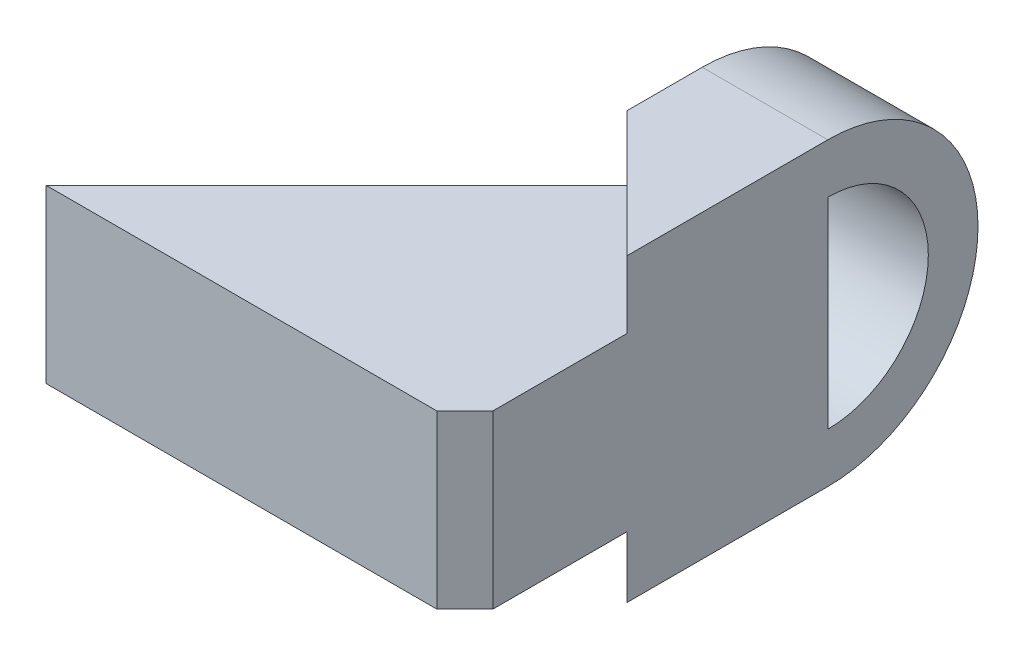
ISO-10303-21;
HEADER;
FILE_DESCRIPTION(('STEP AP214'),'2;1');
FILE_NAME('part.step','',(''),(''),'','','');
FILE_SCHEMA(('AUTOMOTIVE_DESIGN { 1 0 10303 214 1 1 1 1 }'));
ENDSEC;
DATA;
#1=APPLICATION_CONTEXT('core data for automotive mechanical design processes');
#2=APPLICATION_PROTOCOL_DEFINITION('international standard','automotive_design',2000,#1);
#3=PRODUCT_CONTEXT('',#1,'mechanical');
#4=PRODUCT('Part','Part','',(#3));
#5=PRODUCT_RELATED_PRODUCT_CATEGORY('part','',(#4));
#6=PRODUCT_DEFINITION_FORMATION('','',#4);
#7=PRODUCT_DEFINITION_CONTEXT('part definition',#1,'design');
#8=PRODUCT_DEFINITION('design','',#6,#7);
#9=PRODUCT_DEFINITION_SHAPE('','',#8);
#10=(LENGTH_UNIT() NAMED_UNIT(*) SI_UNIT(.MILLI.,.METRE.));
#11=(NAMED_UNIT(*) PLANE_ANGLE_UNIT() SI_UNIT($,.RADIAN.));
#12=(NAMED_UNIT(*) SI_UNIT($,.STERADIAN.) SOLID_ANGLE_UNIT());
#13=UNCERTAINTY_MEASURE_WITH_UNIT(LENGTH_MEASURE(1.E-05),#10,'distance_accuracy_value','');
#14=(GEOMETRIC_REPRESENTATION_CONTEXT(3) GLOBAL_UNCERTAINTY_ASSIGNED_CONTEXT((#13)) GLOBAL_UNIT_ASSIGNED_CONTEXT((#10,
#11,#12)) REPRESENTATION_CONTEXT('',''));
#15=CARTESIAN_POINT('',(0.,0.,0.));
#16=DIRECTION('',(0.,0.,1.));
#17=DIRECTION('',(1.,0.,0.));
#18=AXIS2_PLACEMENT_3D('',#15,#16,#17);
#19=CARTESIAN_POINT('',(15.0000000000003,0.,21.));
#20=DIRECTION('',(-0.707106781186544,0.,0.707106781186551));
#21=DIRECTION('',(0.,1.,0.));
#22=AXIS2_PLACEMENT_3D('',#19,#20,#21);
#23=PLANE('',#22);
#24=DIRECTION('',(-0.707106781186551,0.,-0.707106781186544));
#25=VECTOR('',#24,1.);
#26=CARTESIAN_POINT('',(1.81789792113166,6.59564539546917,7.81789792113153));
#27=LINE('',#26,#25);
#28=CARTESIAN_POINT('',(9.99999999999999,6.59564539546917,15.9999999999998));
#29=VERTEX_POINT('',#28);
#30=CARTESIAN_POINT('',(0.,6.59564539546917,5.99999999999989));
#31=VERTEX_POINT('',#30);
#32=EDGE_CURVE('E208',#29,#31,#27,.T.);
#33=ORIENTED_EDGE('',*,*,#32,.F.);
#34=DIRECTION('',(0.,-1.,0.));
#35=VECTOR('',#34,1.);
#36=CARTESIAN_POINT('',(9.99999999999999,0.,15.9999999999998));
#37=LINE('',#36,#35);
#38=CARTESIAN_POINT('',(9.99999999999999,11.9554978606266,15.9999999999998));
#39=VERTEX_POINT('',#38);
#40=EDGE_CURVE('E249',#39,#29,#37,.T.);
#41=ORIENTED_EDGE('',*,*,#40,.F.);
#42=DIRECTION('',(0.707106781186551,0.,0.707106781186544));
#43=VECTOR('',#42,1.);
#44=CARTESIAN_POINT('',(15.0000000000003,11.9554978606266,21.));
#45=LINE('',#44,#43);
#46=CARTESIAN_POINT('',(0.,11.9554978606266,5.99999999999989));
#47=VERTEX_POINT('',#46);
#48=EDGE_CURVE('E258',#47,#39,#45,.T.);
#49=ORIENTED_EDGE('',*,*,#48,.F.);
#50=DIRECTION('',(0.,1.,0.));
#51=VECTOR('',#50,1.);
#52=CARTESIAN_POINT('',(0.,11.9554978606266,5.99999999999989));
#53=LINE('',#52,#51);
#54=EDGE_CURVE('E254',#31,#47,#53,.T.);
#55=ORIENTED_EDGE('',*,*,#54,.F.);
#56=EDGE_LOOP('',(#33,#41,#49,#55));
#57=FACE_BOUND('',#56,.T.);
#58=ADVANCED_FACE('F46',(#57),#23,.T.);
#59=CARTESIAN_POINT('',(9.99999999999999,0.,0.));
#60=DIRECTION('',(-1.,0.,0.));
#61=DIRECTION('',(0.,0.,1.));
#62=AXIS2_PLACEMENT_3D('',#59,#60,#61);
#63=CYLINDRICAL_SURFACE('',#62,11.9554978606266);
#64=DIRECTION('',(-1.,0.,0.));
#65=VECTOR('',#64,1.);
#66=CARTESIAN_POINT('',(0.,11.9554978606266,0.));
#67=LINE('',#66,#65);
#68=CARTESIAN_POINT('',(9.99999999999999,11.9554978606266,0.));
#69=VERTEX_POINT('',#68);
#70=CARTESIAN_POINT('',(0.,11.9554978606266,0.));
#71=VERTEX_POINT('',#70);
#72=EDGE_CURVE('E219',#69,#71,#67,.T.);
#73=ORIENTED_EDGE('',*,*,#72,.F.);
#74=CARTESIAN_POINT('',(9.99999999999999,0.,0.));
#75=DIRECTION('',(1.,0.,0.));
#76=DIRECTION('',(0.,0.,-1.));
#77=AXIS2_PLACEMENT_3D('',#74,#75,#76);
#78=CIRCLE('',#77,11.9554978606266);
#79=CARTESIAN_POINT('',(9.99999999999999,-11.9554978606266,0.));
#80=VERTEX_POINT('',#79);
#81=EDGE_CURVE('E237',#80,#69,#78,.T.);
#82=ORIENTED_EDGE('',*,*,#81,.F.);
#83=DIRECTION('',(1.,0.,0.));
#84=VECTOR('',#83,1.);
#85=CARTESIAN_POINT('',(0.,-11.9554978606266,0.));
#86=LINE('',#85,#84);
#87=CARTESIAN_POINT('',(0.,-11.9554978606266,0.));
#88=VERTEX_POINT('',#87);
#89=EDGE_CURVE('E213',#88,#80,#86,.T.);
#90=ORIENTED_EDGE('',*,*,#89,.F.);
#91=CARTESIAN_POINT('',(0.,0.,0.));
#92=DIRECTION('',(1.,0.,0.));
#93=DIRECTION('',(0.,0.,-1.));
#94=AXIS2_PLACEMENT_3D('',#91,#92,#93);
#95=CIRCLE('',#94,11.9554978606266);
#96=EDGE_CURVE('E234',#88,#71,#95,.T.);
#97=ORIENTED_EDGE('',*,*,#96,.T.);
#98=EDGE_LOOP('',(#73,#82,#90,#97));
#99=FACE_BOUND('',#98,.T.);
#100=ADVANCED_FACE('F318',(#99),#63,.T.);
#101=CARTESIAN_POINT('',(9.99999999999999,0.,0.));
#102=DIRECTION('',(-1.,0.,0.));
#103=DIRECTION('',(0.,0.,1.));
#104=AXIS2_PLACEMENT_3D('',#101,#102,#103);
#105=CYLINDRICAL_SURFACE('',#104,8.);
#106=CARTESIAN_POINT('',(9.99999999999999,0.,0.));
#107=DIRECTION('',(1.,0.,0.));
#108=DIRECTION('',(0.,0.,-1.));
#109=AXIS2_PLACEMENT_3D('',#106,#107,#108);
#110=CIRCLE('',#109,8.);
#111=CARTESIAN_POINT('',(9.99999999999999,-8.,0.));
#112=VERTEX_POINT('',#111);
#113=CARTESIAN_POINT('',(9.99999999999999,8.,0.));
#114=VERTEX_POINT('',#113);
#115=EDGE_CURVE('E231',#112,#114,#110,.T.);
#116=ORIENTED_EDGE('',*,*,#115,.T.);
#117=DIRECTION('',(-1.,0.,0.));
#118=VECTOR('',#117,1.);
#119=CARTESIAN_POINT('',(9.99999999999999,8.,0.));
#120=LINE('',#119,#118);
#121=CARTESIAN_POINT('',(0.,8.,0.));
#122=VERTEX_POINT('',#121);
#123=EDGE_CURVE('E245',#114,#122,#120,.T.);
#124=ORIENTED_EDGE('',*,*,#123,.T.);
#125=CARTESIAN_POINT('',(0.,0.,0.));
#126=DIRECTION('',(1.,0.,0.));
#127=DIRECTION('',(0.,0.,-1.));
#128=AXIS2_PLACEMENT_3D('',#125,#126,#127);
#129=CIRCLE('',#128,8.);
#130=CARTESIAN_POINT('',(0.,-8.,0.));
#131=VERTEX_POINT('',#130);
#132=EDGE_CURVE('E230',#131,#122,#129,.T.);
#133=ORIENTED_EDGE('',*,*,#132,.F.);
#134=DIRECTION('',(-1.,0.,0.));
#135=VECTOR('',#134,1.);
#136=CARTESIAN_POINT('',(9.99999999999999,-8.,0.));
#137=LINE('',#136,#135);
#138=EDGE_CURVE('E240',#131,#112,#137,.F.);
#139=ORIENTED_EDGE('',*,*,#138,.T.);
#140=EDGE_LOOP('',(#116,#124,#133,#139));
#141=FACE_BOUND('',#140,.T.);
#142=ADVANCED_FACE('F286',(#141),#105,.F.);
#143=CARTESIAN_POINT('',(9.99999999999999,0.,0.));
#144=DIRECTION('',(1.,0.,0.));
#145=DIRECTION('',(0.,0.,-1.));
#146=AXIS2_PLACEMENT_3D('',#143,#144,#145);
#147=PLANE('',#146);
#148=ORIENTED_EDGE('',*,*,#40,.T.);
#149=DIRECTION('',(0.,0.,1.));
#150=VECTOR('',#149,1.);
#151=CARTESIAN_POINT('',(9.99999999999999,6.59564539546917,4.10429891407645));
#152=LINE('',#151,#150);
#153=CARTESIAN_POINT('',(10.,6.59564539546917,26.6654108615308));
#154=VERTEX_POINT('',#153);
#155=EDGE_CURVE('E157',#29,#154,#152,.T.);
#156=ORIENTED_EDGE('',*,*,#155,.T.);
#157=DIRECTION('',(0.,-1.,0.));
#158=VECTOR('',#157,1.);
#159=CARTESIAN_POINT('',(9.99999999999999,0.,26.6654108615308));
#160=LINE('',#159,#158);
#161=CARTESIAN_POINT('',(9.99999999999999,-7.07359071398134,26.6654108615308));
#162=VERTEX_POINT('',#161);
#163=EDGE_CURVE('E170',#154,#162,#160,.T.);
#164=ORIENTED_EDGE('',*,*,#163,.T.);
#165=DIRECTION('',(0.,0.,1.));
#166=VECTOR('',#165,1.);
#167=CARTESIAN_POINT('',(10.,-7.07359071398134,31.1524217002877));
#168=LINE('',#167,#166);
#169=CARTESIAN_POINT('',(10.,-7.07359071398134,15.9999999999998));
#170=VERTEX_POINT('',#169);
#171=EDGE_CURVE('E176',#170,#162,#168,.T.);
#172=ORIENTED_EDGE('',*,*,#171,.F.);
#173=CARTESIAN_POINT('',(9.99999999999999,-11.9554978606266,15.9999999999998));
#174=VERTEX_POINT('',#173);
#175=EDGE_CURVE('E248',#170,#174,#37,.T.);
#176=ORIENTED_EDGE('',*,*,#175,.T.);
#177=DIRECTION('',(0.,0.,-1.));
#178=VECTOR('',#177,1.);
#179=CARTESIAN_POINT('',(9.99999999999999,-11.9554978606266,21.));
#180=LINE('',#179,#178);
#181=EDGE_CURVE('E226',#174,#80,#180,.T.);
#182=ORIENTED_EDGE('',*,*,#181,.T.);
#183=ORIENTED_EDGE('',*,*,#81,.T.);
#184=DIRECTION('',(0.,0.,-1.));
#185=VECTOR('',#184,1.);
#186=CARTESIAN_POINT('',(9.99999999999999,11.9554978606266,21.));
#187=LINE('',#186,#185);
#188=EDGE_CURVE('E224',#39,#69,#187,.T.);
#189=ORIENTED_EDGE('',*,*,#188,.F.);
#190=EDGE_LOOP('',(#148,#156,#164,#172,#176,#182,#183,#189));
#191=FACE_BOUND('',#190,.T.);
#192=DIRECTION('',(0.,1.,0.));
#193=VECTOR('',#192,1.);
#194=CARTESIAN_POINT('',(9.99999999999999,11.9554978606266,0.));
#195=LINE('',#194,#193);
#196=EDGE_CURVE('E216',#112,#114,#195,.T.);
#197=ORIENTED_EDGE('',*,*,#196,.T.);
#198=ORIENTED_EDGE('',*,*,#115,.F.);
#199=EDGE_LOOP('',(#197,#198));
#200=FACE_BOUND('',#199,.T.);
#201=ADVANCED_FACE('F285',(#191,#200),#147,.T.);
#202=CARTESIAN_POINT('',(0.,0.,0.));
#203=DIRECTION('',(1.,0.,0.));
#204=DIRECTION('',(0.,0.,-1.));
#205=AXIS2_PLACEMENT_3D('',#202,#203,#204);
#206=PLANE('',#205);
#207=ORIENTED_EDGE('',*,*,#132,.T.);
#208=DIRECTION('',(0.,-1.,0.));
#209=VECTOR('',#208,1.);
#210=CARTESIAN_POINT('',(0.,11.9554978606266,0.));
#211=LINE('',#210,#209);
#212=EDGE_CURVE('E210',#122,#131,#211,.T.);
#213=ORIENTED_EDGE('',*,*,#212,.T.);
#214=EDGE_LOOP('',(#207,#213));
#215=FACE_BOUND('',#214,.T.);
#216=DIRECTION('',(0.,-1.,0.));
#217=VECTOR('',#216,1.);
#218=CARTESIAN_POINT('',(0.,0.,5.55271248932269));
#219=LINE('',#218,#217);
#220=CARTESIAN_POINT('',(0.,6.59564539546917,5.55271248932268));
#221=VERTEX_POINT('',#220);
#222=CARTESIAN_POINT('',(0.,-7.07359071398134,5.55271248932268));
#223=VERTEX_POINT('',#222);
#224=EDGE_CURVE('E202',#221,#223,#219,.T.);
#225=ORIENTED_EDGE('',*,*,#224,.F.);
#226=DIRECTION('',(0.,0.,1.));
#227=VECTOR('',#226,1.);
#228=CARTESIAN_POINT('',(0.,6.59564539546917,0.));
#229=LINE('',#228,#227);
#230=EDGE_CURVE('E197',#221,#31,#229,.T.);
#231=ORIENTED_EDGE('',*,*,#230,.T.);
#232=ORIENTED_EDGE('',*,*,#54,.T.);
#233=DIRECTION('',(0.,0.,-1.));
#234=VECTOR('',#233,1.);
#235=CARTESIAN_POINT('',(0.,11.9554978606266,21.));
#236=LINE('',#235,#234);
#237=EDGE_CURVE('E222',#47,#71,#236,.T.);
#238=ORIENTED_EDGE('',*,*,#237,.T.);
#239=ORIENTED_EDGE('',*,*,#96,.F.);
#240=DIRECTION('',(0.,0.,-1.));
#241=VECTOR('',#240,1.);
#242=CARTESIAN_POINT('',(0.,-11.9554978606266,21.));
#243=LINE('',#242,#241);
#244=CARTESIAN_POINT('',(0.,-11.9554978606266,5.99999999999989));
#245=VERTEX_POINT('',#244);
#246=EDGE_CURVE('E228',#245,#88,#243,.T.);
#247=ORIENTED_EDGE('',*,*,#246,.F.);
#248=CARTESIAN_POINT('',(0.,-7.07359071398134,5.99999999999989));
#249=VERTEX_POINT('',#248);
#250=EDGE_CURVE('E255',#245,#249,#53,.T.);
#251=ORIENTED_EDGE('',*,*,#250,.T.);
#252=DIRECTION('',(0.,0.,-1.));
#253=VECTOR('',#252,1.);
#254=CARTESIAN_POINT('',(0.,-7.07359071398134,0.));
#255=LINE('',#254,#253);
#256=EDGE_CURVE('E190',#249,#223,#255,.T.);
#257=ORIENTED_EDGE('',*,*,#256,.T.);
#258=EDGE_LOOP('',(#225,#231,#232,#238,#239,#247,#251,#257));
#259=FACE_BOUND('',#258,.T.);
#260=ADVANCED_FACE('F279',(#215,#259),#206,.F.);
#261=CARTESIAN_POINT('',(0.,0.,0.));
#262=DIRECTION('',(0.,0.,1.));
#263=DIRECTION('',(1.,0.,0.));
#264=AXIS2_PLACEMENT_3D('',#261,#262,#263);
#265=PLANE('',#264);
#266=DIRECTION('',(0.,1.,0.));
#267=VECTOR('',#266,1.);
#268=CARTESIAN_POINT('',(5.8957010859235,0.,0.));
#269=LINE('',#268,#267);
#270=CARTESIAN_POINT('',(5.8957010859235,-7.07359071398134,0.));
#271=VERTEX_POINT('',#270);
#272=CARTESIAN_POINT('',(5.8957010859235,6.59564539546917,0.));
#273=VERTEX_POINT('',#272);
#274=EDGE_CURVE('E55',#271,#273,#269,.T.);
#275=ORIENTED_EDGE('',*,*,#274,.T.);
#276=DIRECTION('',(-1.,0.,0.));
#277=VECTOR('',#276,1.);
#278=CARTESIAN_POINT('',(0.,6.59564539546917,0.));
#279=LINE('',#278,#277);
#280=CARTESIAN_POINT('',(5.55271248932263,6.59564539546917,0.));
#281=VERTEX_POINT('',#280);
#282=EDGE_CURVE('E200',#273,#281,#279,.T.);
#283=ORIENTED_EDGE('',*,*,#282,.T.);
#284=DIRECTION('',(0.,1.,0.));
#285=VECTOR('',#284,1.);
#286=CARTESIAN_POINT('',(5.55271248932263,0.,0.));
#287=LINE('',#286,#285);
#288=CARTESIAN_POINT('',(5.55271248932263,-7.07359071398134,0.));
#289=VERTEX_POINT('',#288);
#290=EDGE_CURVE('E260',#289,#281,#287,.T.);
#291=ORIENTED_EDGE('',*,*,#290,.F.);
#292=DIRECTION('',(1.,0.,0.));
#293=VECTOR('',#292,1.);
#294=CARTESIAN_POINT('',(0.,-7.07359071398134,0.));
#295=LINE('',#294,#293);
#296=EDGE_CURVE('E195',#289,#271,#295,.T.);
#297=ORIENTED_EDGE('',*,*,#296,.T.);
#298=EDGE_LOOP('',(#275,#283,#291,#297));
#299=FACE_BOUND('',#298,.T.);
#300=ORIENTED_EDGE('',*,*,#123,.F.);
#301=ORIENTED_EDGE('',*,*,#196,.F.);
#302=ORIENTED_EDGE('',*,*,#138,.F.);
#303=ORIENTED_EDGE('',*,*,#212,.F.);
#304=EDGE_LOOP('',(#300,#301,#302,#303));
#305=FACE_BOUND('',#304,.T.);
#306=ADVANCED_FACE('F275',(#299,#305),#265,.F.);
#307=CARTESIAN_POINT('',(0.,-11.9554978606266,21.));
#308=DIRECTION('',(0.,1.,0.));
#309=DIRECTION('',(0.,0.,1.));
#310=AXIS2_PLACEMENT_3D('',#307,#308,#309);
#311=PLANE('',#310);
#312=ORIENTED_EDGE('',*,*,#181,.F.);
#313=DIRECTION('',(-0.707106781186551,0.,-0.707106781186544));
#314=VECTOR('',#313,1.);
#315=CARTESIAN_POINT('',(15.0000000000003,-11.9554978606266,21.));
#316=LINE('',#315,#314);
#317=EDGE_CURVE('E252',#174,#245,#316,.T.);
#318=ORIENTED_EDGE('',*,*,#317,.T.);
#319=ORIENTED_EDGE('',*,*,#246,.T.);
#320=ORIENTED_EDGE('',*,*,#89,.T.);
#321=EDGE_LOOP('',(#312,#318,#319,#320));
#322=FACE_BOUND('',#321,.T.);
#323=ADVANCED_FACE('F278',(#322),#311,.F.);
#324=CARTESIAN_POINT('',(0.,11.9554978606266,21.));
#325=DIRECTION('',(0.,-1.,0.));
#326=DIRECTION('',(0.,0.,-1.));
#327=AXIS2_PLACEMENT_3D('',#324,#325,#326);
#328=PLANE('',#327);
#329=ORIENTED_EDGE('',*,*,#237,.F.);
#330=ORIENTED_EDGE('',*,*,#48,.T.);
#331=ORIENTED_EDGE('',*,*,#188,.T.);
#332=ORIENTED_EDGE('',*,*,#72,.T.);
#333=EDGE_LOOP('',(#329,#330,#331,#332));
#334=FACE_BOUND('',#333,.T.);
#335=ADVANCED_FACE('F320',(#334),#328,.F.);
#336=DIRECTION('',(0.707106781186551,0.,0.707106781186544));
#337=VECTOR('',#336,1.);
#338=CARTESIAN_POINT('',(1.81789792113166,-7.07359071398134,7.81789792113153));
#339=LINE('',#338,#337);
#340=EDGE_CURVE('E205',#249,#170,#339,.T.);
#341=ORIENTED_EDGE('',*,*,#340,.F.);
#342=ORIENTED_EDGE('',*,*,#250,.F.);
#343=ORIENTED_EDGE('',*,*,#317,.F.);
#344=ORIENTED_EDGE('',*,*,#175,.F.);
#345=EDGE_LOOP('',(#341,#342,#343,#344));
#346=FACE_BOUND('',#345,.T.);
#347=ADVANCED_FACE('F49',(#346),#23,.T.);
#348=CARTESIAN_POINT('',(-21.5166258580243,-7.07359071398134,31.1524217002877));
#349=DIRECTION('',(0.,1.,0.));
#350=DIRECTION('',(0.,0.,1.));
#351=AXIS2_PLACEMENT_3D('',#348,#349,#350);
#352=PLANE('',#351);
#353=DIRECTION('',(0.707106781186544,0.,-0.707106781186551));
#354=VECTOR('',#353,1.);
#355=CARTESIAN_POINT('',(-8.00181834839042,-7.07359071398134,44.6672292099214));
#356=LINE('',#355,#354);
#357=CARTESIAN_POINT('',(7.76684612010531,-7.07359071398134,28.8985647414255));
#358=VERTEX_POINT('',#357);
#359=EDGE_CURVE('E172',#358,#162,#356,.T.);
#360=ORIENTED_EDGE('',*,*,#359,.F.);
#361=DIRECTION('',(-1.,0.,0.));
#362=VECTOR('',#361,1.);
#363=CARTESIAN_POINT('',(-21.5166258580243,-7.07359071398134,28.8985647414255));
#364=LINE('',#363,#362);
#365=CARTESIAN_POINT('',(-23.3458522521026,-7.07359071398134,28.8985647414255));
#366=VERTEX_POINT('',#365);
#367=EDGE_CURVE('E153',#358,#366,#364,.T.);
#368=ORIENTED_EDGE('',*,*,#367,.T.);
#369=DIRECTION('',(0.707106781186544,0.,-0.707106781186551));
#370=VECTOR('',#369,1.);
#371=CARTESIAN_POINT('',(-23.5581675344946,-7.07359071398134,29.1108800238175));
#372=LINE('',#371,#370);
#373=EDGE_CURVE('E174',#366,#223,#372,.T.);
#374=ORIENTED_EDGE('',*,*,#373,.T.);
#375=ORIENTED_EDGE('',*,*,#256,.F.);
#376=ORIENTED_EDGE('',*,*,#340,.T.);
#377=ORIENTED_EDGE('',*,*,#171,.T.);
#378=EDGE_LOOP('',(#360,#368,#374,#375,#376,#377));
#379=FACE_BOUND('',#378,.T.);
#380=ADVANCED_FACE('F298',(#379),#352,.F.);
#381=CARTESIAN_POINT('',(-21.5166258580243,6.59564539546917,31.1524217002877));
#382=DIRECTION('',(0.,-1.,0.));
#383=DIRECTION('',(0.,0.,-1.));
#384=AXIS2_PLACEMENT_3D('',#381,#382,#383);
#385=PLANE('',#384);
#386=DIRECTION('',(-0.707106781186544,0.,0.707106781186551));
#387=VECTOR('',#386,1.);
#388=CARTESIAN_POINT('',(-23.5581675344946,6.59564539546917,29.1108800238175));
#389=LINE('',#388,#387);
#390=CARTESIAN_POINT('',(-23.3458522521026,6.59564539546917,28.8985647414255));
#391=VERTEX_POINT('',#390);
#392=EDGE_CURVE('E165',#221,#391,#389,.T.);
#393=ORIENTED_EDGE('',*,*,#392,.T.);
#394=DIRECTION('',(-1.,0.,0.));
#395=VECTOR('',#394,1.);
#396=CARTESIAN_POINT('',(-23.7704828168863,6.59564539546917,28.8985647414255));
#397=LINE('',#396,#395);
#398=CARTESIAN_POINT('',(7.76684612010532,6.59564539546917,28.8985647414255));
#399=VERTEX_POINT('',#398);
#400=EDGE_CURVE('E62',#399,#391,#397,.T.);
#401=ORIENTED_EDGE('',*,*,#400,.F.);
#402=DIRECTION('',(-0.707106781186544,0.,0.707106781186551));
#403=VECTOR('',#402,1.);
#404=CARTESIAN_POINT('',(-8.00181834839042,6.59564539546917,44.6672292099214));
#405=LINE('',#404,#403);
#406=EDGE_CURVE('E163',#154,#399,#405,.T.);
#407=ORIENTED_EDGE('',*,*,#406,.F.);
#408=ORIENTED_EDGE('',*,*,#155,.F.);
#409=ORIENTED_EDGE('',*,*,#32,.T.);
#410=ORIENTED_EDGE('',*,*,#230,.F.);
#411=EDGE_LOOP('',(#393,#401,#407,#408,#409,#410));
#412=FACE_BOUND('',#411,.T.);
#413=ADVANCED_FACE('F162',(#412),#385,.F.);
#414=CARTESIAN_POINT('',(18.3327054307655,0.,18.3327054307653));
#415=DIRECTION('',(0.707106781186551,0.,0.707106781186544));
#416=DIRECTION('',(0.707106781186544,0.,-0.707106781186551));
#417=AXIS2_PLACEMENT_3D('',#414,#415,#416);
#418=PLANE('',#417);
#419=DIRECTION('',(0.,1.,0.));
#420=VECTOR('',#419,1.);
#421=CARTESIAN_POINT('',(7.76684612010532,0.,28.8985647414255));
#422=LINE('',#421,#420);
#423=EDGE_CURVE('E150',#358,#399,#422,.T.);
#424=ORIENTED_EDGE('',*,*,#423,.F.);
#425=ORIENTED_EDGE('',*,*,#359,.T.);
#426=ORIENTED_EDGE('',*,*,#163,.F.);
#427=ORIENTED_EDGE('',*,*,#406,.T.);
#428=EDGE_LOOP('',(#424,#425,#426,#427));
#429=FACE_BOUND('',#428,.T.);
#430=ADVANCED_FACE('F168',(#429),#418,.T.);
#431=CARTESIAN_POINT('',(2.77635624466134,0.,2.77635624466132));
#432=DIRECTION('',(0.707106781186551,0.,0.707106781186544));
#433=DIRECTION('',(0.707106781186544,0.,-0.707106781186551));
#434=AXIS2_PLACEMENT_3D('',#431,#432,#433);
#435=PLANE('',#434);
#436=ORIENTED_EDGE('',*,*,#373,.F.);
#437=DIRECTION('',(0.,1.,0.));
#438=VECTOR('',#437,1.);
#439=CARTESIAN_POINT('',(-23.3458522521026,0.,28.8985647414255));
#440=LINE('',#439,#438);
#441=EDGE_CURVE('E11',#366,#391,#440,.T.);
#442=ORIENTED_EDGE('',*,*,#441,.T.);
#443=ORIENTED_EDGE('',*,*,#392,.F.);
#444=ORIENTED_EDGE('',*,*,#224,.T.);
#445=EDGE_LOOP('',(#436,#442,#443,#444));
#446=FACE_BOUND('',#445,.T.);
#447=ADVANCED_FACE('F296',(#446),#435,.F.);
#448=CARTESIAN_POINT('',(5.72420678762306,6.59564539546917,-0.171494298300443));
#449=DIRECTION('',(0.707106781186544,0.,-0.707106781186551));
#450=DIRECTION('',(-0.707106781186551,0.,-0.707106781186544));
#451=AXIS2_PLACEMENT_3D('',#448,#449,#450);
#452=PLANE('',#451);
#453=ORIENTED_EDGE('',*,*,#274,.F.);
#454=DIRECTION('',(0.707106781186551,0.,0.707106781186544));
#455=VECTOR('',#454,1.);
#456=CARTESIAN_POINT('',(5.72420678762306,-7.07359071398134,-0.171494298300441));
#457=LINE('',#456,#455);
#458=CARTESIAN_POINT('',(5.72420678762306,-7.07359071398134,-0.171494298300441));
#459=VERTEX_POINT('',#458);
#460=EDGE_CURVE('E186',#459,#271,#457,.T.);
#461=ORIENTED_EDGE('',*,*,#460,.F.);
#462=DIRECTION('',(0.,1.,0.));
#463=VECTOR('',#462,1.);
#464=CARTESIAN_POINT('',(5.72420678762306,6.59564539546917,-0.171494298300443));
#465=LINE('',#464,#463);
#466=CARTESIAN_POINT('',(5.72420678762306,6.59564539546917,-0.171494298300443));
#467=VERTEX_POINT('',#466);
#468=EDGE_CURVE('E180',#459,#467,#465,.T.);
#469=ORIENTED_EDGE('',*,*,#468,.T.);
#470=DIRECTION('',(0.707106781186551,0.,0.707106781186544));
#471=VECTOR('',#470,1.);
#472=CARTESIAN_POINT('',(5.72420678762306,6.59564539546917,-0.171494298300443));
#473=LINE('',#472,#471);
#474=EDGE_CURVE('E187',#467,#273,#473,.T.);
#475=ORIENTED_EDGE('',*,*,#474,.T.);
#476=EDGE_LOOP('',(#453,#461,#469,#475));
#477=FACE_BOUND('',#476,.T.);
#478=ADVANCED_FACE('F272',(#477),#452,.T.);
#479=EDGE_CURVE('E171',#289,#459,#372,.T.);
#480=ORIENTED_EDGE('',*,*,#479,.F.);
#481=ORIENTED_EDGE('',*,*,#290,.T.);
#482=EDGE_CURVE('E183',#467,#281,#389,.T.);
#483=ORIENTED_EDGE('',*,*,#482,.F.);
#484=ORIENTED_EDGE('',*,*,#468,.F.);
#485=EDGE_LOOP('',(#480,#481,#483,#484));
#486=FACE_BOUND('',#485,.T.);
#487=ADVANCED_FACE('F265',(#486),#435,.F.);
#488=CARTESIAN_POINT('',(-23.5581675344946,6.59564539546917,29.1108800238175));
#489=DIRECTION('',(0.,1.,0.));
#490=DIRECTION('',(0.,0.,1.));
#491=AXIS2_PLACEMENT_3D('',#488,#489,#490);
#492=PLANE('',#491);
#493=ORIENTED_EDGE('',*,*,#282,.F.);
#494=ORIENTED_EDGE('',*,*,#474,.F.);
#495=ORIENTED_EDGE('',*,*,#482,.T.);
#496=EDGE_LOOP('',(#493,#494,#495));
#497=FACE_BOUND('',#496,.T.);
#498=ADVANCED_FACE('F269',(#497),#492,.T.);
#499=CARTESIAN_POINT('',(-23.5581675344946,-7.07359071398134,29.1108800238175));
#500=DIRECTION('',(0.,-1.,0.));
#501=DIRECTION('',(0.,0.,-1.));
#502=AXIS2_PLACEMENT_3D('',#499,#500,#501);
#503=PLANE('',#502);
#504=ORIENTED_EDGE('',*,*,#296,.F.);
#505=ORIENTED_EDGE('',*,*,#479,.T.);
#506=ORIENTED_EDGE('',*,*,#460,.T.);
#507=EDGE_LOOP('',(#504,#505,#506));
#508=FACE_BOUND('',#507,.T.);
#509=ADVANCED_FACE('F274',(#508),#503,.T.);
#510=CARTESIAN_POINT('',(-23.7704828168863,-11.9554978606266,28.8985647414255));
#511=DIRECTION('',(0.,0.,-1.));
#512=DIRECTION('',(-1.,0.,0.));
#513=AXIS2_PLACEMENT_3D('',#510,#511,#512);
#514=PLANE('',#513);
#515=ORIENTED_EDGE('',*,*,#423,.T.);
#516=ORIENTED_EDGE('',*,*,#400,.T.);
#517=ORIENTED_EDGE('',*,*,#441,.F.);
#518=ORIENTED_EDGE('',*,*,#367,.F.);
#519=EDGE_LOOP('',(#515,#516,#517,#518));
#520=FACE_BOUND('',#519,.T.);
#521=ADVANCED_FACE('F151',(#520),#514,.F.);
#522=CLOSED_SHELL('',(#58,#100,#142,#201,#260,#306,#323,#335,#347,#380,#413,#430,#447,#478,#487,
#498,#509,#521));
#523=MANIFOLD_SOLID_BREP('B2',#522);
#524=ADVANCED_BREP_SHAPE_REPRESENTATION('',(#18,#523),#14);
#525=SHAPE_DEFINITION_REPRESENTATION(#9,#524);
ENDSEC;
END-ISO-10303-21;
